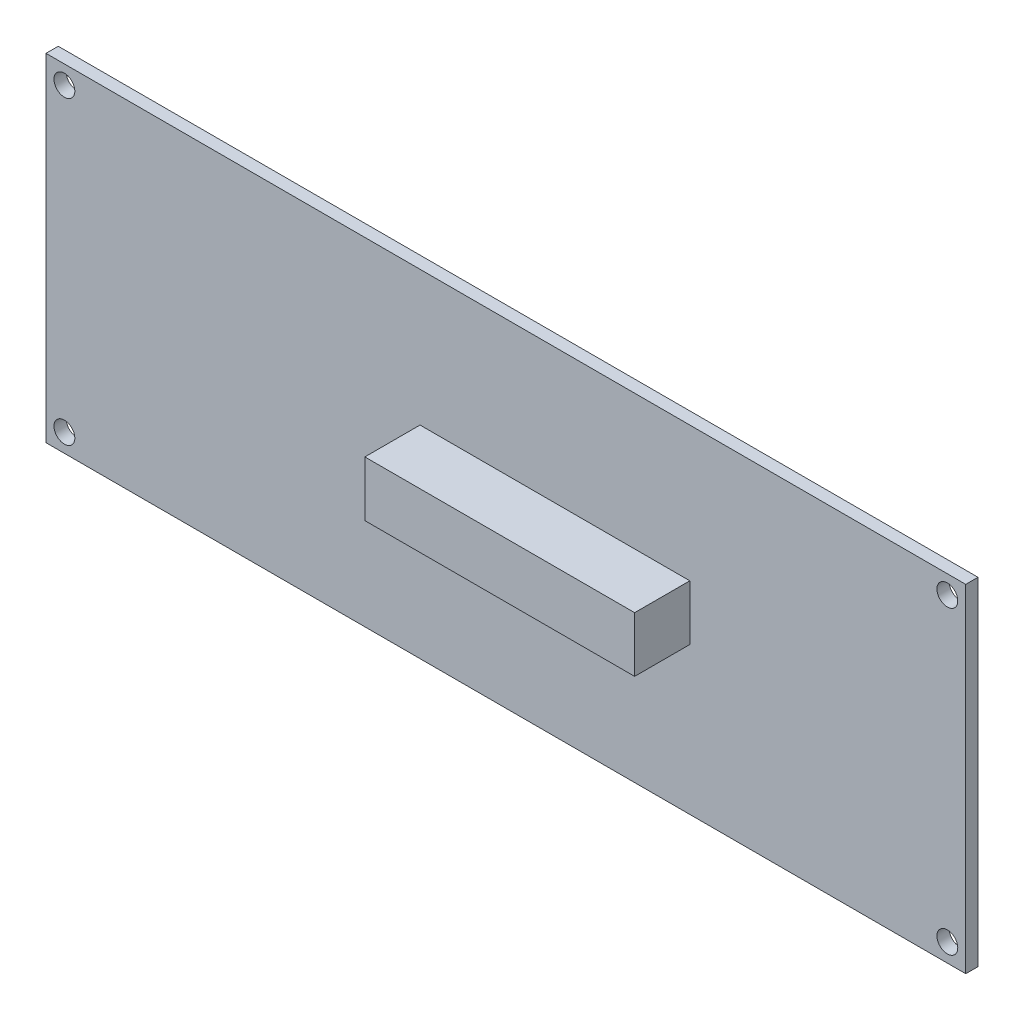
ISO-10303-21;
HEADER;
FILE_DESCRIPTION(('STEP AP214'),'2;1');
FILE_NAME('part.step','',(''),(''),'','','');
FILE_SCHEMA(('AUTOMOTIVE_DESIGN { 1 0 10303 214 1 1 1 1 }'));
ENDSEC;
DATA;
#1=APPLICATION_CONTEXT('core data for automotive mechanical design processes');
#2=APPLICATION_PROTOCOL_DEFINITION('international standard','automotive_design',2000,#1);
#3=PRODUCT_CONTEXT('',#1,'mechanical');
#4=PRODUCT('Part','Part','',(#3));
#5=PRODUCT_RELATED_PRODUCT_CATEGORY('part','',(#4));
#6=PRODUCT_DEFINITION_FORMATION('','',#4);
#7=PRODUCT_DEFINITION_CONTEXT('part definition',#1,'design');
#8=PRODUCT_DEFINITION('design','',#6,#7);
#9=PRODUCT_DEFINITION_SHAPE('','',#8);
#10=(LENGTH_UNIT() NAMED_UNIT(*) SI_UNIT(.MILLI.,.METRE.));
#11=(NAMED_UNIT(*) PLANE_ANGLE_UNIT() SI_UNIT($,.RADIAN.));
#12=(NAMED_UNIT(*) SI_UNIT($,.STERADIAN.) SOLID_ANGLE_UNIT());
#13=UNCERTAINTY_MEASURE_WITH_UNIT(LENGTH_MEASURE(1.E-05),#10,'distance_accuracy_value','');
#14=(GEOMETRIC_REPRESENTATION_CONTEXT(3) GLOBAL_UNCERTAINTY_ASSIGNED_CONTEXT((#13)) GLOBAL_UNIT_ASSIGNED_CONTEXT((#10,
#11,#12)) REPRESENTATION_CONTEXT('',''));
#15=CARTESIAN_POINT('',(0.,0.,0.));
#16=DIRECTION('',(0.,0.,1.));
#17=DIRECTION('',(1.,0.,0.));
#18=AXIS2_PLACEMENT_3D('',#15,#16,#17);
#19=CARTESIAN_POINT('',(0.,0.,2.));
#20=DIRECTION('',(0.,0.,1.));
#21=DIRECTION('',(1.,0.,0.));
#22=AXIS2_PLACEMENT_3D('',#19,#20,#21);
#23=PLANE('',#22);
#24=CARTESIAN_POINT('',(72.,-24.5,2.));
#25=DIRECTION('',(0.,0.,1.));
#26=DIRECTION('',(1.,0.,0.));
#27=AXIS2_PLACEMENT_3D('',#24,#25,#26);
#28=CIRCLE('',#27,1.7);
#29=CARTESIAN_POINT('',(73.7,-24.5,2.));
#30=VERTEX_POINT('',#29);
#31=EDGE_CURVE('E143',#30,#30,#28,.T.);
#32=ORIENTED_EDGE('',*,*,#31,.F.);
#33=EDGE_LOOP('',(#32));
#34=FACE_BOUND('',#33,.T.);
#35=CARTESIAN_POINT('',(-72.,24.5,2.));
#36=DIRECTION('',(0.,0.,1.));
#37=DIRECTION('',(1.,0.,0.));
#38=AXIS2_PLACEMENT_3D('',#35,#36,#37);
#39=CIRCLE('',#38,1.7);
#40=CARTESIAN_POINT('',(-70.3,24.5,2.));
#41=VERTEX_POINT('',#40);
#42=EDGE_CURVE('E155',#41,#41,#39,.T.);
#43=ORIENTED_EDGE('',*,*,#42,.F.);
#44=EDGE_LOOP('',(#43));
#45=FACE_BOUND('',#44,.T.);
#46=DIRECTION('',(0.,-1.,0.));
#47=VECTOR('',#46,1.);
#48=CARTESIAN_POINT('',(-75.,27.5,2.));
#49=LINE('',#48,#47);
#50=CARTESIAN_POINT('',(-75.,27.5,2.));
#51=VERTEX_POINT('',#50);
#52=CARTESIAN_POINT('',(-75.,-27.5,2.));
#53=VERTEX_POINT('',#52);
#54=EDGE_CURVE('E161',#51,#53,#49,.T.);
#55=ORIENTED_EDGE('',*,*,#54,.T.);
#56=DIRECTION('',(1.,0.,0.));
#57=VECTOR('',#56,1.);
#58=CARTESIAN_POINT('',(-75.,-27.5,2.));
#59=LINE('',#58,#57);
#60=CARTESIAN_POINT('',(75.,-27.5,2.));
#61=VERTEX_POINT('',#60);
#62=EDGE_CURVE('E85',#53,#61,#59,.T.);
#63=ORIENTED_EDGE('',*,*,#62,.T.);
#64=DIRECTION('',(0.,1.,0.));
#65=VECTOR('',#64,1.);
#66=CARTESIAN_POINT('',(75.,27.5,2.));
#67=LINE('',#66,#65);
#68=CARTESIAN_POINT('',(75.,27.5,2.));
#69=VERTEX_POINT('',#68);
#70=EDGE_CURVE('E164',#61,#69,#67,.T.);
#71=ORIENTED_EDGE('',*,*,#70,.T.);
#72=DIRECTION('',(-1.,0.,0.));
#73=VECTOR('',#72,1.);
#74=CARTESIAN_POINT('',(-75.,27.5,2.));
#75=LINE('',#74,#73);
#76=EDGE_CURVE('E57',#69,#51,#75,.T.);
#77=ORIENTED_EDGE('',*,*,#76,.T.);
#78=EDGE_LOOP('',(#55,#63,#71,#77));
#79=FACE_BOUND('',#78,.T.);
#80=CARTESIAN_POINT('',(72.,24.5,2.));
#81=DIRECTION('',(0.,0.,1.));
#82=DIRECTION('',(-1.,0.,0.));
#83=AXIS2_PLACEMENT_3D('',#80,#81,#82);
#84=CIRCLE('',#83,1.7);
#85=CARTESIAN_POINT('',(70.3,24.5,2.));
#86=VERTEX_POINT('',#85);
#87=EDGE_CURVE('E149',#86,#86,#84,.T.);
#88=ORIENTED_EDGE('',*,*,#87,.F.);
#89=EDGE_LOOP('',(#88));
#90=FACE_BOUND('',#89,.T.);
#91=CARTESIAN_POINT('',(-72.,-24.5,2.));
#92=DIRECTION('',(0.,0.,1.));
#93=DIRECTION('',(-1.,0.,0.));
#94=AXIS2_PLACEMENT_3D('',#91,#92,#93);
#95=CIRCLE('',#94,1.7);
#96=CARTESIAN_POINT('',(-73.7,-24.5,2.));
#97=VERTEX_POINT('',#96);
#98=EDGE_CURVE('E135',#97,#97,#95,.T.);
#99=ORIENTED_EDGE('',*,*,#98,.F.);
#100=EDGE_LOOP('',(#99));
#101=FACE_BOUND('',#100,.T.);
#102=DIRECTION('',(1.,0.,0.));
#103=VECTOR('',#102,1.);
#104=CARTESIAN_POINT('',(-14.,-3.5,2.));
#105=LINE('',#104,#103);
#106=CARTESIAN_POINT('',(-14.,-3.5,2.));
#107=VERTEX_POINT('',#106);
#108=CARTESIAN_POINT('',(30.,-3.5,2.));
#109=VERTEX_POINT('',#108);
#110=EDGE_CURVE('E331',#107,#109,#105,.T.);
#111=ORIENTED_EDGE('',*,*,#110,.F.);
#112=DIRECTION('',(0.,-1.,0.));
#113=VECTOR('',#112,1.);
#114=CARTESIAN_POINT('',(-14.,5.49999999999999,2.));
#115=LINE('',#114,#113);
#116=CARTESIAN_POINT('',(-14.,5.49999999999999,2.));
#117=VERTEX_POINT('',#116);
#118=EDGE_CURVE('E130',#117,#107,#115,.T.);
#119=ORIENTED_EDGE('',*,*,#118,.F.);
#120=DIRECTION('',(-1.,0.,0.));
#121=VECTOR('',#120,1.);
#122=CARTESIAN_POINT('',(-14.,5.49999999999999,2.));
#123=LINE('',#122,#121);
#124=CARTESIAN_POINT('',(30.,5.49999999999999,2.));
#125=VERTEX_POINT('',#124);
#126=EDGE_CURVE('E126',#125,#117,#123,.T.);
#127=ORIENTED_EDGE('',*,*,#126,.F.);
#128=DIRECTION('',(0.,1.,0.));
#129=VECTOR('',#128,1.);
#130=CARTESIAN_POINT('',(30.,5.49999999999999,2.));
#131=LINE('',#130,#129);
#132=EDGE_CURVE('E328',#109,#125,#131,.T.);
#133=ORIENTED_EDGE('',*,*,#132,.F.);
#134=EDGE_LOOP('',(#111,#119,#127,#133));
#135=FACE_BOUND('',#134,.T.);
#136=ADVANCED_FACE('F33',(#34,#45,#79,#90,#101,#135),#23,.T.);
#137=CARTESIAN_POINT('',(0.,0.,0.));
#138=DIRECTION('',(0.,0.,1.));
#139=DIRECTION('',(1.,0.,0.));
#140=AXIS2_PLACEMENT_3D('',#137,#138,#139);
#141=PLANE('',#140);
#142=DIRECTION('',(0.,-1.,0.));
#143=VECTOR('',#142,1.);
#144=CARTESIAN_POINT('',(-75.,27.5,0.));
#145=LINE('',#144,#143);
#146=CARTESIAN_POINT('',(-75.,27.5,0.));
#147=VERTEX_POINT('',#146);
#148=CARTESIAN_POINT('',(-75.,-27.5,0.));
#149=VERTEX_POINT('',#148);
#150=EDGE_CURVE('E158',#147,#149,#145,.T.);
#151=ORIENTED_EDGE('',*,*,#150,.F.);
#152=DIRECTION('',(-1.,0.,0.));
#153=VECTOR('',#152,1.);
#154=CARTESIAN_POINT('',(-75.,27.5,0.));
#155=LINE('',#154,#153);
#156=CARTESIAN_POINT('',(75.,27.5,0.));
#157=VERTEX_POINT('',#156);
#158=EDGE_CURVE('E78',#157,#147,#155,.T.);
#159=ORIENTED_EDGE('',*,*,#158,.F.);
#160=DIRECTION('',(0.,1.,0.));
#161=VECTOR('',#160,1.);
#162=CARTESIAN_POINT('',(75.,27.5,0.));
#163=LINE('',#162,#161);
#164=CARTESIAN_POINT('',(75.,-27.5,0.));
#165=VERTEX_POINT('',#164);
#166=EDGE_CURVE('E172',#165,#157,#163,.T.);
#167=ORIENTED_EDGE('',*,*,#166,.F.);
#168=DIRECTION('',(1.,0.,0.));
#169=VECTOR('',#168,1.);
#170=CARTESIAN_POINT('',(-75.,-27.5,0.));
#171=LINE('',#170,#169);
#172=EDGE_CURVE('E170',#149,#165,#171,.T.);
#173=ORIENTED_EDGE('',*,*,#172,.F.);
#174=EDGE_LOOP('',(#151,#159,#167,#173));
#175=FACE_BOUND('',#174,.T.);
#176=CARTESIAN_POINT('',(-72.,24.5,0.));
#177=DIRECTION('',(0.,0.,1.));
#178=DIRECTION('',(1.,0.,0.));
#179=AXIS2_PLACEMENT_3D('',#176,#177,#178);
#180=CIRCLE('',#179,1.7);
#181=CARTESIAN_POINT('',(-70.3,24.5,0.));
#182=VERTEX_POINT('',#181);
#183=EDGE_CURVE('E152',#182,#182,#180,.T.);
#184=ORIENTED_EDGE('',*,*,#183,.T.);
#185=EDGE_LOOP('',(#184));
#186=FACE_BOUND('',#185,.T.);
#187=CARTESIAN_POINT('',(72.,24.5,0.));
#188=DIRECTION('',(0.,0.,1.));
#189=DIRECTION('',(-1.,0.,0.));
#190=AXIS2_PLACEMENT_3D('',#187,#188,#189);
#191=CIRCLE('',#190,1.7);
#192=CARTESIAN_POINT('',(70.3,24.5,0.));
#193=VERTEX_POINT('',#192);
#194=EDGE_CURVE('E146',#193,#193,#191,.T.);
#195=ORIENTED_EDGE('',*,*,#194,.T.);
#196=EDGE_LOOP('',(#195));
#197=FACE_BOUND('',#196,.T.);
#198=CARTESIAN_POINT('',(72.,-24.5,0.));
#199=DIRECTION('',(0.,0.,1.));
#200=DIRECTION('',(1.,0.,0.));
#201=AXIS2_PLACEMENT_3D('',#198,#199,#200);
#202=CIRCLE('',#201,1.7);
#203=CARTESIAN_POINT('',(73.7,-24.5,0.));
#204=VERTEX_POINT('',#203);
#205=EDGE_CURVE('E141',#204,#204,#202,.T.);
#206=ORIENTED_EDGE('',*,*,#205,.T.);
#207=EDGE_LOOP('',(#206));
#208=FACE_BOUND('',#207,.T.);
#209=CARTESIAN_POINT('',(-72.,-24.5,0.));
#210=DIRECTION('',(0.,0.,1.));
#211=DIRECTION('',(-1.,0.,0.));
#212=AXIS2_PLACEMENT_3D('',#209,#210,#211);
#213=CIRCLE('',#212,1.7);
#214=CARTESIAN_POINT('',(-73.7,-24.5,0.));
#215=VERTEX_POINT('',#214);
#216=EDGE_CURVE('E132',#215,#215,#213,.T.);
#217=ORIENTED_EDGE('',*,*,#216,.T.);
#218=EDGE_LOOP('',(#217));
#219=FACE_BOUND('',#218,.T.);
#220=ADVANCED_FACE('F185',(#175,#186,#197,#208,#219),#141,.F.);
#221=CARTESIAN_POINT('',(-75.,27.5,2.));
#222=DIRECTION('',(1.,0.,0.));
#223=DIRECTION('',(0.,0.,-1.));
#224=AXIS2_PLACEMENT_3D('',#221,#222,#223);
#225=PLANE('',#224);
#226=ORIENTED_EDGE('',*,*,#150,.T.);
#227=DIRECTION('',(0.,0.,-1.));
#228=VECTOR('',#227,1.);
#229=CARTESIAN_POINT('',(-75.,-27.5,2.));
#230=LINE('',#229,#228);
#231=EDGE_CURVE('E11',#53,#149,#230,.T.);
#232=ORIENTED_EDGE('',*,*,#231,.F.);
#233=ORIENTED_EDGE('',*,*,#54,.F.);
#234=DIRECTION('',(0.,0.,-1.));
#235=VECTOR('',#234,1.);
#236=CARTESIAN_POINT('',(-75.,27.5,2.));
#237=LINE('',#236,#235);
#238=EDGE_CURVE('E167',#51,#147,#237,.T.);
#239=ORIENTED_EDGE('',*,*,#238,.T.);
#240=EDGE_LOOP('',(#226,#232,#233,#239));
#241=FACE_BOUND('',#240,.T.);
#242=ADVANCED_FACE('F35',(#241),#225,.F.);
#243=CARTESIAN_POINT('',(-75.,-27.5,2.));
#244=DIRECTION('',(0.,1.,0.));
#245=DIRECTION('',(-1.,0.,0.));
#246=AXIS2_PLACEMENT_3D('',#243,#244,#245);
#247=PLANE('',#246);
#248=ORIENTED_EDGE('',*,*,#172,.T.);
#249=DIRECTION('',(0.,0.,-1.));
#250=VECTOR('',#249,1.);
#251=CARTESIAN_POINT('',(75.,-27.5,2.));
#252=LINE('',#251,#250);
#253=EDGE_CURVE('E41',#61,#165,#252,.T.);
#254=ORIENTED_EDGE('',*,*,#253,.F.);
#255=ORIENTED_EDGE('',*,*,#62,.F.);
#256=ORIENTED_EDGE('',*,*,#231,.T.);
#257=EDGE_LOOP('',(#248,#254,#255,#256));
#258=FACE_BOUND('',#257,.T.);
#259=ADVANCED_FACE('F201',(#258),#247,.F.);
#260=CARTESIAN_POINT('',(75.,27.5,2.));
#261=DIRECTION('',(-1.,0.,0.));
#262=DIRECTION('',(0.,0.,1.));
#263=AXIS2_PLACEMENT_3D('',#260,#261,#262);
#264=PLANE('',#263);
#265=ORIENTED_EDGE('',*,*,#166,.T.);
#266=DIRECTION('',(0.,0.,-1.));
#267=VECTOR('',#266,1.);
#268=CARTESIAN_POINT('',(75.,27.5,2.));
#269=LINE('',#268,#267);
#270=EDGE_CURVE('E176',#69,#157,#269,.T.);
#271=ORIENTED_EDGE('',*,*,#270,.F.);
#272=ORIENTED_EDGE('',*,*,#70,.F.);
#273=ORIENTED_EDGE('',*,*,#253,.T.);
#274=EDGE_LOOP('',(#265,#271,#272,#273));
#275=FACE_BOUND('',#274,.T.);
#276=ADVANCED_FACE('F181',(#275),#264,.F.);
#277=CARTESIAN_POINT('',(-75.,27.5,2.));
#278=DIRECTION('',(0.,-1.,0.));
#279=DIRECTION('',(0.,0.,-1.));
#280=AXIS2_PLACEMENT_3D('',#277,#278,#279);
#281=PLANE('',#280);
#282=ORIENTED_EDGE('',*,*,#158,.T.);
#283=ORIENTED_EDGE('',*,*,#238,.F.);
#284=ORIENTED_EDGE('',*,*,#76,.F.);
#285=ORIENTED_EDGE('',*,*,#270,.T.);
#286=EDGE_LOOP('',(#282,#283,#284,#285));
#287=FACE_BOUND('',#286,.T.);
#288=ADVANCED_FACE('F190',(#287),#281,.F.);
#289=CARTESIAN_POINT('',(-72.,24.5,2.));
#290=DIRECTION('',(0.,0.,-1.));
#291=DIRECTION('',(-1.,0.,0.));
#292=AXIS2_PLACEMENT_3D('',#289,#290,#291);
#293=CYLINDRICAL_SURFACE('',#292,1.7);
#294=ORIENTED_EDGE('',*,*,#42,.T.);
#295=EDGE_LOOP('',(#294));
#296=FACE_BOUND('',#295,.T.);
#297=ORIENTED_EDGE('',*,*,#183,.F.);
#298=EDGE_LOOP('',(#297));
#299=FACE_BOUND('',#298,.T.);
#300=ADVANCED_FACE('F192',(#296,#299),#293,.F.);
#301=CARTESIAN_POINT('',(72.,24.5,2.));
#302=DIRECTION('',(0.,0.,-1.));
#303=DIRECTION('',(-1.,0.,0.));
#304=AXIS2_PLACEMENT_3D('',#301,#302,#303);
#305=CYLINDRICAL_SURFACE('',#304,1.7);
#306=ORIENTED_EDGE('',*,*,#87,.T.);
#307=EDGE_LOOP('',(#306));
#308=FACE_BOUND('',#307,.T.);
#309=ORIENTED_EDGE('',*,*,#194,.F.);
#310=EDGE_LOOP('',(#309));
#311=FACE_BOUND('',#310,.T.);
#312=ADVANCED_FACE('F198',(#308,#311),#305,.F.);
#313=CARTESIAN_POINT('',(72.,-24.5,2.));
#314=DIRECTION('',(0.,0.,-1.));
#315=DIRECTION('',(-1.,0.,0.));
#316=AXIS2_PLACEMENT_3D('',#313,#314,#315);
#317=CYLINDRICAL_SURFACE('',#316,1.7);
#318=ORIENTED_EDGE('',*,*,#31,.T.);
#319=EDGE_LOOP('',(#318));
#320=FACE_BOUND('',#319,.T.);
#321=ORIENTED_EDGE('',*,*,#205,.F.);
#322=EDGE_LOOP('',(#321));
#323=FACE_BOUND('',#322,.T.);
#324=ADVANCED_FACE('F217',(#320,#323),#317,.F.);
#325=CARTESIAN_POINT('',(-72.,-24.5,2.));
#326=DIRECTION('',(0.,0.,-1.));
#327=DIRECTION('',(-1.,0.,0.));
#328=AXIS2_PLACEMENT_3D('',#325,#326,#327);
#329=CYLINDRICAL_SURFACE('',#328,1.7);
#330=ORIENTED_EDGE('',*,*,#98,.T.);
#331=EDGE_LOOP('',(#330));
#332=FACE_BOUND('',#331,.T.);
#333=ORIENTED_EDGE('',*,*,#216,.F.);
#334=EDGE_LOOP('',(#333));
#335=FACE_BOUND('',#334,.T.);
#336=ADVANCED_FACE('F221',(#332,#335),#329,.F.);
#337=CARTESIAN_POINT('',(-14.,5.49999999999999,11.));
#338=DIRECTION('',(1.,0.,0.));
#339=DIRECTION('',(0.,1.,0.));
#340=AXIS2_PLACEMENT_3D('',#337,#338,#339);
#341=PLANE('',#340);
#342=ORIENTED_EDGE('',*,*,#118,.T.);
#343=DIRECTION('',(0.,0.,-1.));
#344=VECTOR('',#343,1.);
#345=CARTESIAN_POINT('',(-14.,-3.5,11.));
#346=LINE('',#345,#344);
#347=CARTESIAN_POINT('',(-14.,-3.5,11.));
#348=VERTEX_POINT('',#347);
#349=EDGE_CURVE('E111',#348,#107,#346,.T.);
#350=ORIENTED_EDGE('',*,*,#349,.F.);
#351=DIRECTION('',(0.,-1.,0.));
#352=VECTOR('',#351,1.);
#353=CARTESIAN_POINT('',(-14.,5.49999999999999,11.));
#354=LINE('',#353,#352);
#355=CARTESIAN_POINT('',(-14.,5.49999999999999,11.));
#356=VERTEX_POINT('',#355);
#357=EDGE_CURVE('E118',#356,#348,#354,.T.);
#358=ORIENTED_EDGE('',*,*,#357,.F.);
#359=DIRECTION('',(0.,0.,-1.));
#360=VECTOR('',#359,1.);
#361=CARTESIAN_POINT('',(-14.,5.49999999999999,11.));
#362=LINE('',#361,#360);
#363=EDGE_CURVE('E325',#356,#117,#362,.T.);
#364=ORIENTED_EDGE('',*,*,#363,.T.);
#365=EDGE_LOOP('',(#342,#350,#358,#364));
#366=FACE_BOUND('',#365,.T.);
#367=ADVANCED_FACE('F128',(#366),#341,.F.);
#368=CARTESIAN_POINT('',(-14.,-3.5,11.));
#369=DIRECTION('',(0.,1.,0.));
#370=DIRECTION('',(0.,0.,1.));
#371=AXIS2_PLACEMENT_3D('',#368,#369,#370);
#372=PLANE('',#371);
#373=ORIENTED_EDGE('',*,*,#110,.T.);
#374=DIRECTION('',(0.,0.,-1.));
#375=VECTOR('',#374,1.);
#376=CARTESIAN_POINT('',(30.,-3.5,11.));
#377=LINE('',#376,#375);
#378=CARTESIAN_POINT('',(30.,-3.5,11.));
#379=VERTEX_POINT('',#378);
#380=EDGE_CURVE('E114',#379,#109,#377,.T.);
#381=ORIENTED_EDGE('',*,*,#380,.F.);
#382=DIRECTION('',(1.,0.,0.));
#383=VECTOR('',#382,1.);
#384=CARTESIAN_POINT('',(-14.,-3.5,11.));
#385=LINE('',#384,#383);
#386=EDGE_CURVE('E107',#348,#379,#385,.T.);
#387=ORIENTED_EDGE('',*,*,#386,.F.);
#388=ORIENTED_EDGE('',*,*,#349,.T.);
#389=EDGE_LOOP('',(#373,#381,#387,#388));
#390=FACE_BOUND('',#389,.T.);
#391=ADVANCED_FACE('F109',(#390),#372,.F.);
#392=CARTESIAN_POINT('',(30.,5.49999999999999,11.));
#393=DIRECTION('',(-1.,0.,0.));
#394=DIRECTION('',(0.,-1.,0.));
#395=AXIS2_PLACEMENT_3D('',#392,#393,#394);
#396=PLANE('',#395);
#397=ORIENTED_EDGE('',*,*,#132,.T.);
#398=DIRECTION('',(0.,0.,-1.));
#399=VECTOR('',#398,1.);
#400=CARTESIAN_POINT('',(30.,5.49999999999999,11.));
#401=LINE('',#400,#399);
#402=CARTESIAN_POINT('',(30.,5.49999999999999,11.));
#403=VERTEX_POINT('',#402);
#404=EDGE_CURVE('E48',#403,#125,#401,.T.);
#405=ORIENTED_EDGE('',*,*,#404,.F.);
#406=DIRECTION('',(0.,1.,0.));
#407=VECTOR('',#406,1.);
#408=CARTESIAN_POINT('',(30.,5.49999999999999,11.));
#409=LINE('',#408,#407);
#410=EDGE_CURVE('E117',#379,#403,#409,.T.);
#411=ORIENTED_EDGE('',*,*,#410,.F.);
#412=ORIENTED_EDGE('',*,*,#380,.T.);
#413=EDGE_LOOP('',(#397,#405,#411,#412));
#414=FACE_BOUND('',#413,.T.);
#415=ADVANCED_FACE('F230',(#414),#396,.F.);
#416=CARTESIAN_POINT('',(-14.,5.49999999999999,11.));
#417=DIRECTION('',(0.,-1.,0.));
#418=DIRECTION('',(0.,0.,-1.));
#419=AXIS2_PLACEMENT_3D('',#416,#417,#418);
#420=PLANE('',#419);
#421=ORIENTED_EDGE('',*,*,#126,.T.);
#422=ORIENTED_EDGE('',*,*,#363,.F.);
#423=DIRECTION('',(-1.,0.,0.));
#424=VECTOR('',#423,1.);
#425=CARTESIAN_POINT('',(-14.,5.49999999999999,11.));
#426=LINE('',#425,#424);
#427=EDGE_CURVE('E122',#403,#356,#426,.T.);
#428=ORIENTED_EDGE('',*,*,#427,.F.);
#429=ORIENTED_EDGE('',*,*,#404,.T.);
#430=EDGE_LOOP('',(#421,#422,#428,#429));
#431=FACE_BOUND('',#430,.T.);
#432=ADVANCED_FACE('F233',(#431),#420,.F.);
#433=CARTESIAN_POINT('',(0.,0.,11.));
#434=DIRECTION('',(0.,0.,1.));
#435=DIRECTION('',(1.,0.,0.));
#436=AXIS2_PLACEMENT_3D('',#433,#434,#435);
#437=PLANE('',#436);
#438=ORIENTED_EDGE('',*,*,#357,.T.);
#439=ORIENTED_EDGE('',*,*,#386,.T.);
#440=ORIENTED_EDGE('',*,*,#410,.T.);
#441=ORIENTED_EDGE('',*,*,#427,.T.);
#442=EDGE_LOOP('',(#438,#439,#440,#441));
#443=FACE_BOUND('',#442,.T.);
#444=ADVANCED_FACE('F121',(#443),#437,.T.);
#445=CLOSED_SHELL('',(#136,#220,#242,#259,#276,#288,#300,#312,#324,#336,#367,#391,#415,#432,#444));
#446=MANIFOLD_SOLID_BREP('B2',#445);
#447=ADVANCED_BREP_SHAPE_REPRESENTATION('',(#18,#446),#14);
#448=SHAPE_DEFINITION_REPRESENTATION(#9,#447);
ENDSEC;
END-ISO-10303-21;
